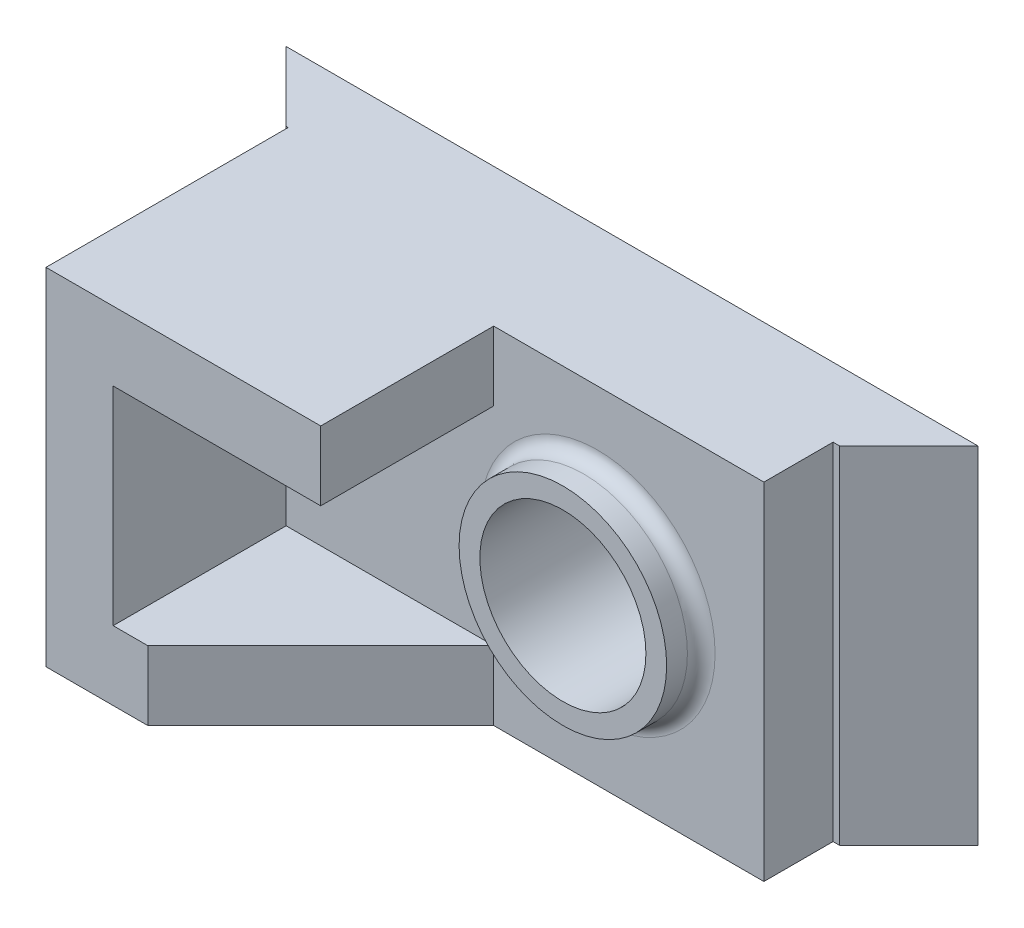
ISO-10303-21;
HEADER;
FILE_DESCRIPTION(('STEP AP214'),'2;1');
FILE_NAME('part.step','',(''),(''),'','','');
FILE_SCHEMA(('AUTOMOTIVE_DESIGN { 1 0 10303 214 1 1 1 1 }'));
ENDSEC;
DATA;
#1=APPLICATION_CONTEXT('core data for automotive mechanical design processes');
#2=APPLICATION_PROTOCOL_DEFINITION('international standard','automotive_design',2000,#1);
#3=PRODUCT_CONTEXT('',#1,'mechanical');
#4=PRODUCT('Part','Part','',(#3));
#5=PRODUCT_RELATED_PRODUCT_CATEGORY('part','',(#4));
#6=PRODUCT_DEFINITION_FORMATION('','',#4);
#7=PRODUCT_DEFINITION_CONTEXT('part definition',#1,'design');
#8=PRODUCT_DEFINITION('design','',#6,#7);
#9=PRODUCT_DEFINITION_SHAPE('','',#8);
#10=(LENGTH_UNIT() NAMED_UNIT(*) SI_UNIT(.MILLI.,.METRE.));
#11=(NAMED_UNIT(*) PLANE_ANGLE_UNIT() SI_UNIT($,.RADIAN.));
#12=(NAMED_UNIT(*) SI_UNIT($,.STERADIAN.) SOLID_ANGLE_UNIT());
#13=UNCERTAINTY_MEASURE_WITH_UNIT(LENGTH_MEASURE(1.E-05),#10,'distance_accuracy_value','');
#14=(GEOMETRIC_REPRESENTATION_CONTEXT(3) GLOBAL_UNCERTAINTY_ASSIGNED_CONTEXT((#13)) GLOBAL_UNIT_ASSIGNED_CONTEXT((#10,
#11,#12)) REPRESENTATION_CONTEXT('',''));
#15=CARTESIAN_POINT('',(0.,0.,0.));
#16=DIRECTION('',(0.,0.,1.));
#17=DIRECTION('',(1.,0.,0.));
#18=AXIS2_PLACEMENT_3D('',#15,#16,#17);
#19=CARTESIAN_POINT('',(0.,-25.,10.));
#20=DIRECTION('',(0.,1.,0.));
#21=DIRECTION('',(0.,0.,1.));
#22=AXIS2_PLACEMENT_3D('',#19,#20,#21);
#23=PLANE('',#22);
#24=DIRECTION('',(1.,0.,0.));
#25=VECTOR('',#24,1.);
#26=CARTESIAN_POINT('',(0.,-25.,10.));
#27=LINE('',#26,#25);
#28=CARTESIAN_POINT('',(-40.,-25.,10.));
#29=VERTEX_POINT('',#28);
#30=CARTESIAN_POINT('',(-39.7065882183788,-25.,10.));
#31=VERTEX_POINT('',#30);
#32=EDGE_CURVE('E239',#29,#31,#27,.T.);
#33=ORIENTED_EDGE('',*,*,#32,.F.);
#34=DIRECTION('',(-0.707106781186546,0.,-0.707106781186549));
#35=VECTOR('',#34,1.);
#36=CARTESIAN_POINT('',(-40.,-25.,10.));
#37=LINE('',#36,#35);
#38=CARTESIAN_POINT('',(-50.,-25.,0.));
#39=VERTEX_POINT('',#38);
#40=EDGE_CURVE('E58',#29,#39,#37,.T.);
#41=ORIENTED_EDGE('',*,*,#40,.T.);
#42=DIRECTION('',(1.,0.,0.));
#43=VECTOR('',#42,1.);
#44=CARTESIAN_POINT('',(0.,-25.,0.));
#45=LINE('',#44,#43);
#46=CARTESIAN_POINT('',(50.,-25.,0.));
#47=VERTEX_POINT('',#46);
#48=EDGE_CURVE('E249',#39,#47,#45,.T.);
#49=ORIENTED_EDGE('',*,*,#48,.T.);
#50=DIRECTION('',(0.707106781186549,0.,-0.707106781186547));
#51=VECTOR('',#50,1.);
#52=CARTESIAN_POINT('',(50.,-25.,0.));
#53=LINE('',#52,#51);
#54=CARTESIAN_POINT('',(40.,-25.,10.));
#55=VERTEX_POINT('',#54);
#56=EDGE_CURVE('E174',#47,#55,#53,.F.);
#57=ORIENTED_EDGE('',*,*,#56,.T.);
#58=DIRECTION('',(1.,0.,0.));
#59=VECTOR('',#58,1.);
#60=CARTESIAN_POINT('',(0.,-25.,10.));
#61=LINE('',#60,#59);
#62=CARTESIAN_POINT('',(39.0533062407241,-25.,10.));
#63=VERTEX_POINT('',#62);
#64=EDGE_CURVE('E167',#63,#55,#61,.T.);
#65=ORIENTED_EDGE('',*,*,#64,.F.);
#66=DIRECTION('',(0.,0.,-1.));
#67=VECTOR('',#66,1.);
#68=CARTESIAN_POINT('',(39.0533062407241,-25.,20.));
#69=LINE('',#68,#67);
#70=CARTESIAN_POINT('',(39.0533062407241,-25.,20.));
#71=VERTEX_POINT('',#70);
#72=EDGE_CURVE('E150',#71,#63,#69,.T.);
#73=ORIENTED_EDGE('',*,*,#72,.F.);
#74=DIRECTION('',(1.,0.,0.));
#75=VECTOR('',#74,1.);
#76=CARTESIAN_POINT('',(0.,-25.,20.));
#77=LINE('',#76,#75);
#78=CARTESIAN_POINT('',(0.,-25.,20.));
#79=VERTEX_POINT('',#78);
#80=EDGE_CURVE('E161',#79,#71,#77,.T.);
#81=ORIENTED_EDGE('',*,*,#80,.F.);
#82=DIRECTION('',(0.707106781186549,0.,-0.707106781186546));
#83=VECTOR('',#82,1.);
#84=CARTESIAN_POINT('',(0.,-25.,20.));
#85=LINE('',#84,#83);
#86=CARTESIAN_POINT('',(-25.0000000000001,-25.,45.));
#87=VERTEX_POINT('',#86);
#88=EDGE_CURVE('E258',#79,#87,#85,.F.);
#89=ORIENTED_EDGE('',*,*,#88,.T.);
#90=DIRECTION('',(1.,0.,0.));
#91=VECTOR('',#90,1.);
#92=CARTESIAN_POINT('',(0.,-25.,45.));
#93=LINE('',#92,#91);
#94=CARTESIAN_POINT('',(-39.7065882183788,-25.,45.));
#95=VERTEX_POINT('',#94);
#96=EDGE_CURVE('E214',#95,#87,#93,.T.);
#97=ORIENTED_EDGE('',*,*,#96,.F.);
#98=DIRECTION('',(0.,0.,-1.));
#99=VECTOR('',#98,1.);
#100=CARTESIAN_POINT('',(-39.7065882183788,-25.,45.));
#101=LINE('',#100,#99);
#102=EDGE_CURVE('E223',#95,#31,#101,.T.);
#103=ORIENTED_EDGE('',*,*,#102,.T.);
#104=EDGE_LOOP('',(#33,#41,#49,#57,#65,#73,#81,#89,#97,#103));
#105=FACE_BOUND('',#104,.T.);
#106=ADVANCED_FACE('F49',(#105),#23,.F.);
#107=CARTESIAN_POINT('',(0.,25.,10.));
#108=DIRECTION('',(0.,1.,0.));
#109=DIRECTION('',(0.,0.,1.));
#110=AXIS2_PLACEMENT_3D('',#107,#108,#109);
#111=PLANE('',#110);
#112=DIRECTION('',(1.,0.,0.));
#113=VECTOR('',#112,1.);
#114=CARTESIAN_POINT('',(0.,25.,0.));
#115=LINE('',#114,#113);
#116=CARTESIAN_POINT('',(-50.,25.,0.));
#117=VERTEX_POINT('',#116);
#118=CARTESIAN_POINT('',(50.,25.,0.));
#119=VERTEX_POINT('',#118);
#120=EDGE_CURVE('E242',#117,#119,#115,.T.);
#121=ORIENTED_EDGE('',*,*,#120,.F.);
#122=DIRECTION('',(0.707106781186546,0.,0.707106781186549));
#123=VECTOR('',#122,1.);
#124=CARTESIAN_POINT('',(-20.0000000000001,25.,30.));
#125=LINE('',#124,#123);
#126=CARTESIAN_POINT('',(-40.,25.,10.));
#127=VERTEX_POINT('',#126);
#128=EDGE_CURVE('E12',#117,#127,#125,.T.);
#129=ORIENTED_EDGE('',*,*,#128,.T.);
#130=DIRECTION('',(1.,0.,0.));
#131=VECTOR('',#130,1.);
#132=CARTESIAN_POINT('',(0.,25.,10.));
#133=LINE('',#132,#131);
#134=CARTESIAN_POINT('',(-39.7065882183788,25.,10.));
#135=VERTEX_POINT('',#134);
#136=EDGE_CURVE('E245',#127,#135,#133,.T.);
#137=ORIENTED_EDGE('',*,*,#136,.T.);
#138=DIRECTION('',(0.,0.,-1.));
#139=VECTOR('',#138,1.);
#140=CARTESIAN_POINT('',(-39.7065882183788,25.,45.));
#141=LINE('',#140,#139);
#142=CARTESIAN_POINT('',(-39.7065882183788,25.,45.));
#143=VERTEX_POINT('',#142);
#144=EDGE_CURVE('E226',#143,#135,#141,.T.);
#145=ORIENTED_EDGE('',*,*,#144,.F.);
#146=DIRECTION('',(1.,0.,0.));
#147=VECTOR('',#146,1.);
#148=CARTESIAN_POINT('',(0.,25.,45.));
#149=LINE('',#148,#147);
#150=CARTESIAN_POINT('',(0.,25.,45.));
#151=VERTEX_POINT('',#150);
#152=EDGE_CURVE('E209',#143,#151,#149,.T.);
#153=ORIENTED_EDGE('',*,*,#152,.T.);
#154=DIRECTION('',(0.,0.,-1.));
#155=VECTOR('',#154,1.);
#156=CARTESIAN_POINT('',(0.,25.,45.));
#157=LINE('',#156,#155);
#158=CARTESIAN_POINT('',(0.,25.,20.));
#159=VERTEX_POINT('',#158);
#160=EDGE_CURVE('E229',#151,#159,#157,.T.);
#161=ORIENTED_EDGE('',*,*,#160,.T.);
#162=DIRECTION('',(1.,0.,0.));
#163=VECTOR('',#162,1.);
#164=CARTESIAN_POINT('',(0.,25.,20.));
#165=LINE('',#164,#163);
#166=CARTESIAN_POINT('',(39.0533062407241,25.,20.));
#167=VERTEX_POINT('',#166);
#168=EDGE_CURVE('E176',#159,#167,#165,.T.);
#169=ORIENTED_EDGE('',*,*,#168,.T.);
#170=DIRECTION('',(0.,0.,-1.));
#171=VECTOR('',#170,1.);
#172=CARTESIAN_POINT('',(39.0533062407241,25.,20.));
#173=LINE('',#172,#171);
#174=CARTESIAN_POINT('',(39.0533062407241,25.,10.));
#175=VERTEX_POINT('',#174);
#176=EDGE_CURVE('E160',#167,#175,#173,.T.);
#177=ORIENTED_EDGE('',*,*,#176,.T.);
#178=DIRECTION('',(1.,0.,0.));
#179=VECTOR('',#178,1.);
#180=CARTESIAN_POINT('',(0.,25.,10.));
#181=LINE('',#180,#179);
#182=CARTESIAN_POINT('',(40.,25.,10.));
#183=VERTEX_POINT('',#182);
#184=EDGE_CURVE('E170',#175,#183,#181,.T.);
#185=ORIENTED_EDGE('',*,*,#184,.T.);
#186=DIRECTION('',(-0.707106781186549,0.,0.707106781186547));
#187=VECTOR('',#186,1.);
#188=CARTESIAN_POINT('',(19.9999999999999,25.,30.));
#189=LINE('',#188,#187);
#190=EDGE_CURVE('E267',#183,#119,#189,.F.);
#191=ORIENTED_EDGE('',*,*,#190,.T.);
#192=EDGE_LOOP('',(#121,#129,#137,#145,#153,#161,#169,#177,#185,#191));
#193=FACE_BOUND('',#192,.T.);
#194=ADVANCED_FACE('F278',(#193),#111,.T.);
#195=CARTESIAN_POINT('',(0.,0.,10.));
#196=DIRECTION('',(0.,0.,1.));
#197=DIRECTION('',(1.,0.,0.));
#198=AXIS2_PLACEMENT_3D('',#195,#196,#197);
#199=PLANE('',#198);
#200=ORIENTED_EDGE('',*,*,#136,.F.);
#201=DIRECTION('',(0.,-1.,0.));
#202=VECTOR('',#201,1.);
#203=CARTESIAN_POINT('',(-40.,-25.,10.));
#204=LINE('',#203,#202);
#205=EDGE_CURVE('E269',#127,#29,#204,.T.);
#206=ORIENTED_EDGE('',*,*,#205,.T.);
#207=ORIENTED_EDGE('',*,*,#32,.T.);
#208=DIRECTION('',(0.,-1.,0.));
#209=VECTOR('',#208,1.);
#210=CARTESIAN_POINT('',(-39.7065882183788,0.,10.));
#211=LINE('',#210,#209);
#212=EDGE_CURVE('E241',#135,#31,#211,.T.);
#213=ORIENTED_EDGE('',*,*,#212,.F.);
#214=EDGE_LOOP('',(#200,#206,#207,#213));
#215=FACE_BOUND('',#214,.T.);
#216=ADVANCED_FACE('F276',(#215),#199,.T.);
#217=CARTESIAN_POINT('',(0.,0.,0.));
#218=DIRECTION('',(0.,0.,1.));
#219=DIRECTION('',(1.,0.,0.));
#220=AXIS2_PLACEMENT_3D('',#217,#218,#219);
#221=PLANE('',#220);
#222=ORIENTED_EDGE('',*,*,#120,.T.);
#223=DIRECTION('',(0.,-1.,0.));
#224=VECTOR('',#223,1.);
#225=CARTESIAN_POINT('',(50.,0.,0.));
#226=LINE('',#225,#224);
#227=EDGE_CURVE('E180',#119,#47,#226,.T.);
#228=ORIENTED_EDGE('',*,*,#227,.T.);
#229=ORIENTED_EDGE('',*,*,#48,.F.);
#230=DIRECTION('',(0.,-1.,0.));
#231=VECTOR('',#230,1.);
#232=CARTESIAN_POINT('',(-50.,0.,0.));
#233=LINE('',#232,#231);
#234=EDGE_CURVE('E238',#117,#39,#233,.T.);
#235=ORIENTED_EDGE('',*,*,#234,.F.);
#236=EDGE_LOOP('',(#222,#228,#229,#235));
#237=FACE_BOUND('',#236,.T.);
#238=CARTESIAN_POINT('',(15.,0.,0.));
#239=DIRECTION('',(0.,0.,1.));
#240=DIRECTION('',(1.,0.,0.));
#241=AXIS2_PLACEMENT_3D('',#238,#239,#240);
#242=CIRCLE('',#241,12.);
#243=CARTESIAN_POINT('',(27.,0.,0.));
#244=VERTEX_POINT('',#243);
#245=EDGE_CURVE('E350',#244,#244,#242,.T.);
#246=ORIENTED_EDGE('',*,*,#245,.T.);
#247=EDGE_LOOP('',(#246));
#248=FACE_BOUND('',#247,.T.);
#249=ADVANCED_FACE('F272',(#237,#248),#221,.F.);
#250=CARTESIAN_POINT('',(-39.7065882183788,0.,45.));
#251=DIRECTION('',(1.,0.,0.));
#252=DIRECTION('',(0.,0.,-1.));
#253=AXIS2_PLACEMENT_3D('',#250,#251,#252);
#254=PLANE('',#253);
#255=ORIENTED_EDGE('',*,*,#144,.T.);
#256=ORIENTED_EDGE('',*,*,#212,.T.);
#257=ORIENTED_EDGE('',*,*,#102,.F.);
#258=DIRECTION('',(0.,-1.,0.));
#259=VECTOR('',#258,1.);
#260=CARTESIAN_POINT('',(-39.7065882183788,0.,45.));
#261=LINE('',#260,#259);
#262=EDGE_CURVE('E212',#143,#95,#261,.T.);
#263=ORIENTED_EDGE('',*,*,#262,.F.);
#264=EDGE_LOOP('',(#255,#256,#257,#263));
#265=FACE_BOUND('',#264,.T.);
#266=ADVANCED_FACE('F283',(#265),#254,.F.);
#267=CARTESIAN_POINT('',(-30.,0.,45.));
#268=DIRECTION('',(1.,0.,0.));
#269=DIRECTION('',(0.,1.,0.));
#270=AXIS2_PLACEMENT_3D('',#267,#268,#269);
#271=PLANE('',#270);
#272=DIRECTION('',(0.,-1.,0.));
#273=VECTOR('',#272,1.);
#274=CARTESIAN_POINT('',(-30.,0.,20.));
#275=LINE('',#274,#273);
#276=CARTESIAN_POINT('',(-30.,15.,20.));
#277=VERTEX_POINT('',#276);
#278=CARTESIAN_POINT('',(-30.,-15.,20.));
#279=VERTEX_POINT('',#278);
#280=EDGE_CURVE('E191',#277,#279,#275,.T.);
#281=ORIENTED_EDGE('',*,*,#280,.F.);
#282=DIRECTION('',(0.,0.,-1.));
#283=VECTOR('',#282,1.);
#284=CARTESIAN_POINT('',(-30.,15.,45.));
#285=LINE('',#284,#283);
#286=CARTESIAN_POINT('',(-30.,15.,45.));
#287=VERTEX_POINT('',#286);
#288=EDGE_CURVE('E235',#287,#277,#285,.T.);
#289=ORIENTED_EDGE('',*,*,#288,.F.);
#290=DIRECTION('',(0.,-1.,0.));
#291=VECTOR('',#290,1.);
#292=CARTESIAN_POINT('',(-30.,0.,45.));
#293=LINE('',#292,#291);
#294=CARTESIAN_POINT('',(-30.,-15.,45.));
#295=VERTEX_POINT('',#294);
#296=EDGE_CURVE('E201',#287,#295,#293,.T.);
#297=ORIENTED_EDGE('',*,*,#296,.T.);
#298=DIRECTION('',(0.,0.,-1.));
#299=VECTOR('',#298,1.);
#300=CARTESIAN_POINT('',(-30.,-15.,45.));
#301=LINE('',#300,#299);
#302=EDGE_CURVE('E220',#295,#279,#301,.T.);
#303=ORIENTED_EDGE('',*,*,#302,.T.);
#304=EDGE_LOOP('',(#281,#289,#297,#303));
#305=FACE_BOUND('',#304,.T.);
#306=ADVANCED_FACE('F307',(#305),#271,.T.);
#307=CARTESIAN_POINT('',(0.,15.,45.));
#308=DIRECTION('',(0.,1.,0.));
#309=DIRECTION('',(0.,0.,1.));
#310=AXIS2_PLACEMENT_3D('',#307,#308,#309);
#311=PLANE('',#310);
#312=ORIENTED_EDGE('',*,*,#288,.T.);
#313=DIRECTION('',(1.,0.,0.));
#314=VECTOR('',#313,1.);
#315=CARTESIAN_POINT('',(0.,15.,20.));
#316=LINE('',#315,#314);
#317=CARTESIAN_POINT('',(0.,15.,20.));
#318=VERTEX_POINT('',#317);
#319=EDGE_CURVE('E188',#277,#318,#316,.T.);
#320=ORIENTED_EDGE('',*,*,#319,.T.);
#321=DIRECTION('',(0.,0.,-1.));
#322=VECTOR('',#321,1.);
#323=CARTESIAN_POINT('',(0.,15.,45.));
#324=LINE('',#323,#322);
#325=CARTESIAN_POINT('',(0.,15.,45.));
#326=VERTEX_POINT('',#325);
#327=EDGE_CURVE('E232',#326,#318,#324,.T.);
#328=ORIENTED_EDGE('',*,*,#327,.F.);
#329=DIRECTION('',(1.,0.,0.));
#330=VECTOR('',#329,1.);
#331=CARTESIAN_POINT('',(0.,15.,45.));
#332=LINE('',#331,#330);
#333=EDGE_CURVE('E204',#287,#326,#332,.T.);
#334=ORIENTED_EDGE('',*,*,#333,.F.);
#335=EDGE_LOOP('',(#312,#320,#328,#334));
#336=FACE_BOUND('',#335,.T.);
#337=ADVANCED_FACE('F309',(#336),#311,.F.);
#338=CARTESIAN_POINT('',(0.,0.,45.));
#339=DIRECTION('',(1.,0.,0.));
#340=DIRECTION('',(0.,1.,0.));
#341=AXIS2_PLACEMENT_3D('',#338,#339,#340);
#342=PLANE('',#341);
#343=DIRECTION('',(0.,-1.,0.));
#344=VECTOR('',#343,1.);
#345=CARTESIAN_POINT('',(0.,0.,20.));
#346=LINE('',#345,#344);
#347=EDGE_CURVE('E186',#159,#318,#346,.T.);
#348=ORIENTED_EDGE('',*,*,#347,.F.);
#349=ORIENTED_EDGE('',*,*,#160,.F.);
#350=DIRECTION('',(0.,-1.,0.));
#351=VECTOR('',#350,1.);
#352=CARTESIAN_POINT('',(0.,0.,45.));
#353=LINE('',#352,#351);
#354=EDGE_CURVE('E206',#151,#326,#353,.T.);
#355=ORIENTED_EDGE('',*,*,#354,.T.);
#356=ORIENTED_EDGE('',*,*,#327,.T.);
#357=EDGE_LOOP('',(#348,#349,#355,#356));
#358=FACE_BOUND('',#357,.T.);
#359=ADVANCED_FACE('F293',(#358),#342,.T.);
#360=CARTESIAN_POINT('',(0.,-15.,45.));
#361=DIRECTION('',(0.,1.,0.));
#362=DIRECTION('',(-1.,0.,0.));
#363=AXIS2_PLACEMENT_3D('',#360,#361,#362);
#364=PLANE('',#363);
#365=DIRECTION('',(1.,0.,0.));
#366=VECTOR('',#365,1.);
#367=CARTESIAN_POINT('',(0.,-15.,45.));
#368=LINE('',#367,#366);
#369=CARTESIAN_POINT('',(-25.0000000000001,-15.,45.));
#370=VERTEX_POINT('',#369);
#371=EDGE_CURVE('E217',#295,#370,#368,.T.);
#372=ORIENTED_EDGE('',*,*,#371,.T.);
#373=DIRECTION('',(-0.707106781186549,0.,0.707106781186546));
#374=VECTOR('',#373,1.);
#375=CARTESIAN_POINT('',(-12.5,-15.,32.5));
#376=LINE('',#375,#374);
#377=CARTESIAN_POINT('',(0.,-15.,20.));
#378=VERTEX_POINT('',#377);
#379=EDGE_CURVE('E262',#370,#378,#376,.F.);
#380=ORIENTED_EDGE('',*,*,#379,.T.);
#381=DIRECTION('',(1.,0.,0.));
#382=VECTOR('',#381,1.);
#383=CARTESIAN_POINT('',(0.,-15.,20.));
#384=LINE('',#383,#382);
#385=EDGE_CURVE('E193',#279,#378,#384,.T.);
#386=ORIENTED_EDGE('',*,*,#385,.F.);
#387=ORIENTED_EDGE('',*,*,#302,.F.);
#388=EDGE_LOOP('',(#372,#380,#386,#387));
#389=FACE_BOUND('',#388,.T.);
#390=ADVANCED_FACE('F304',(#389),#364,.T.);
#391=CARTESIAN_POINT('',(0.,0.,45.));
#392=DIRECTION('',(0.,0.,1.));
#393=DIRECTION('',(1.,0.,0.));
#394=AXIS2_PLACEMENT_3D('',#391,#392,#393);
#395=PLANE('',#394);
#396=ORIENTED_EDGE('',*,*,#96,.T.);
#397=DIRECTION('',(0.,1.,0.));
#398=VECTOR('',#397,1.);
#399=CARTESIAN_POINT('',(-25.0000000000001,0.,45.));
#400=LINE('',#399,#398);
#401=EDGE_CURVE('E260',#87,#370,#400,.T.);
#402=ORIENTED_EDGE('',*,*,#401,.T.);
#403=ORIENTED_EDGE('',*,*,#371,.F.);
#404=ORIENTED_EDGE('',*,*,#296,.F.);
#405=ORIENTED_EDGE('',*,*,#333,.T.);
#406=ORIENTED_EDGE('',*,*,#354,.F.);
#407=ORIENTED_EDGE('',*,*,#152,.F.);
#408=ORIENTED_EDGE('',*,*,#262,.T.);
#409=EDGE_LOOP('',(#396,#402,#403,#404,#405,#406,#407,#408));
#410=FACE_BOUND('',#409,.T.);
#411=ADVANCED_FACE('F287',(#410),#395,.T.);
#412=CARTESIAN_POINT('',(39.0533062407241,0.,20.));
#413=DIRECTION('',(1.,0.,0.));
#414=DIRECTION('',(0.,0.,-1.));
#415=AXIS2_PLACEMENT_3D('',#412,#413,#414);
#416=PLANE('',#415);
#417=DIRECTION('',(0.,-1.,0.));
#418=VECTOR('',#417,1.);
#419=CARTESIAN_POINT('',(39.0533062407241,0.,10.));
#420=LINE('',#419,#418);
#421=EDGE_CURVE('E153',#175,#63,#420,.T.);
#422=ORIENTED_EDGE('',*,*,#421,.F.);
#423=ORIENTED_EDGE('',*,*,#176,.F.);
#424=DIRECTION('',(0.,-1.,0.));
#425=VECTOR('',#424,1.);
#426=CARTESIAN_POINT('',(39.0533062407241,0.,20.));
#427=LINE('',#426,#425);
#428=EDGE_CURVE('E156',#167,#71,#427,.T.);
#429=ORIENTED_EDGE('',*,*,#428,.T.);
#430=ORIENTED_EDGE('',*,*,#72,.T.);
#431=EDGE_LOOP('',(#422,#423,#429,#430));
#432=FACE_BOUND('',#431,.T.);
#433=ADVANCED_FACE('F152',(#432),#416,.T.);
#434=CARTESIAN_POINT('',(0.,0.,20.));
#435=DIRECTION('',(0.,0.,1.));
#436=DIRECTION('',(1.,0.,0.));
#437=AXIS2_PLACEMENT_3D('',#434,#435,#436);
#438=PLANE('',#437);
#439=CARTESIAN_POINT('',(15.,0.,20.));
#440=DIRECTION('',(0.,0.,1.));
#441=DIRECTION('',(1.,0.,0.));
#442=AXIS2_PLACEMENT_3D('',#439,#440,#441);
#443=CIRCLE('',#442,17.);
#444=CARTESIAN_POINT('',(32.,0.,20.));
#445=VERTEX_POINT('',#444);
#446=EDGE_CURVE('E255',#445,#445,#443,.F.);
#447=ORIENTED_EDGE('',*,*,#446,.T.);
#448=EDGE_LOOP('',(#447));
#449=FACE_BOUND('',#448,.T.);
#450=ORIENTED_EDGE('',*,*,#428,.F.);
#451=ORIENTED_EDGE('',*,*,#168,.F.);
#452=ORIENTED_EDGE('',*,*,#347,.T.);
#453=ORIENTED_EDGE('',*,*,#319,.F.);
#454=ORIENTED_EDGE('',*,*,#280,.T.);
#455=ORIENTED_EDGE('',*,*,#385,.T.);
#456=DIRECTION('',(0.,-1.,0.));
#457=VECTOR('',#456,1.);
#458=CARTESIAN_POINT('',(0.,0.,20.));
#459=LINE('',#458,#457);
#460=EDGE_CURVE('E196',#378,#79,#459,.T.);
#461=ORIENTED_EDGE('',*,*,#460,.T.);
#462=ORIENTED_EDGE('',*,*,#80,.T.);
#463=EDGE_LOOP('',(#450,#451,#452,#453,#454,#455,#461,#462));
#464=FACE_BOUND('',#463,.T.);
#465=ADVANCED_FACE('F295',(#449,#464),#438,.T.);
#466=CARTESIAN_POINT('',(0.,0.,10.));
#467=DIRECTION('',(0.,0.,1.));
#468=DIRECTION('',(1.,0.,0.));
#469=AXIS2_PLACEMENT_3D('',#466,#467,#468);
#470=PLANE('',#469);
#471=ORIENTED_EDGE('',*,*,#64,.T.);
#472=DIRECTION('',(0.,1.,0.));
#473=VECTOR('',#472,1.);
#474=CARTESIAN_POINT('',(40.,0.,10.));
#475=LINE('',#474,#473);
#476=EDGE_CURVE('E265',#55,#183,#475,.T.);
#477=ORIENTED_EDGE('',*,*,#476,.T.);
#478=ORIENTED_EDGE('',*,*,#184,.F.);
#479=ORIENTED_EDGE('',*,*,#421,.T.);
#480=EDGE_LOOP('',(#471,#477,#478,#479));
#481=FACE_BOUND('',#480,.T.);
#482=ADVANCED_FACE('F166',(#481),#470,.T.);
#483=CARTESIAN_POINT('',(0.,0.,25.));
#484=DIRECTION('',(0.,0.,1.));
#485=DIRECTION('',(1.,0.,0.));
#486=AXIS2_PLACEMENT_3D('',#483,#484,#485);
#487=PLANE('',#486);
#488=CARTESIAN_POINT('',(15.,0.,25.));
#489=DIRECTION('',(0.,0.,1.));
#490=DIRECTION('',(1.,0.,0.));
#491=AXIS2_PLACEMENT_3D('',#488,#489,#490);
#492=CIRCLE('',#491,15.);
#493=CARTESIAN_POINT('',(30.,0.,25.));
#494=VERTEX_POINT('',#493);
#495=EDGE_CURVE('E182',#494,#494,#492,.T.);
#496=ORIENTED_EDGE('',*,*,#495,.T.);
#497=EDGE_LOOP('',(#496));
#498=FACE_BOUND('',#497,.T.);
#499=CARTESIAN_POINT('',(15.,0.,25.));
#500=DIRECTION('',(0.,0.,1.));
#501=DIRECTION('',(1.,0.,0.));
#502=AXIS2_PLACEMENT_3D('',#499,#500,#501);
#503=CIRCLE('',#502,12.);
#504=CARTESIAN_POINT('',(27.,0.,25.));
#505=VERTEX_POINT('',#504);
#506=EDGE_CURVE('E349',#505,#505,#503,.T.);
#507=ORIENTED_EDGE('',*,*,#506,.F.);
#508=EDGE_LOOP('',(#507));
#509=FACE_BOUND('',#508,.T.);
#510=ADVANCED_FACE('F358',(#498,#509),#487,.T.);
#511=CARTESIAN_POINT('',(15.,0.,25.));
#512=DIRECTION('',(0.,0.,-1.));
#513=DIRECTION('',(-1.,0.,0.));
#514=AXIS2_PLACEMENT_3D('',#511,#512,#513);
#515=CYLINDRICAL_SURFACE('',#514,15.);
#516=CARTESIAN_POINT('',(15.,0.,22.));
#517=DIRECTION('',(0.,0.,1.));
#518=DIRECTION('',(1.,0.,0.));
#519=AXIS2_PLACEMENT_3D('',#516,#517,#518);
#520=CIRCLE('',#519,15.);
#521=CARTESIAN_POINT('',(30.,0.,22.));
#522=VERTEX_POINT('',#521);
#523=EDGE_CURVE('E247',#522,#522,#520,.T.);
#524=ORIENTED_EDGE('',*,*,#523,.T.);
#525=EDGE_LOOP('',(#524));
#526=FACE_BOUND('',#525,.T.);
#527=ORIENTED_EDGE('',*,*,#495,.F.);
#528=EDGE_LOOP('',(#527));
#529=FACE_BOUND('',#528,.T.);
#530=ADVANCED_FACE('F360',(#526,#529),#515,.T.);
#531=CARTESIAN_POINT('',(15.,0.,25.));
#532=DIRECTION('',(0.,0.,-1.));
#533=DIRECTION('',(-1.,0.,0.));
#534=AXIS2_PLACEMENT_3D('',#531,#532,#533);
#535=CYLINDRICAL_SURFACE('',#534,12.);
#536=ORIENTED_EDGE('',*,*,#506,.T.);
#537=EDGE_LOOP('',(#536));
#538=FACE_BOUND('',#537,.T.);
#539=ORIENTED_EDGE('',*,*,#245,.F.);
#540=EDGE_LOOP('',(#539));
#541=FACE_BOUND('',#540,.T.);
#542=ADVANCED_FACE('F330',(#538,#541),#535,.F.);
#543=CARTESIAN_POINT('',(15.,0.,22.));
#544=DIRECTION('',(0.,0.,1.));
#545=DIRECTION('',(1.,0.,0.));
#546=AXIS2_PLACEMENT_3D('',#543,#544,#545);
#547=TOROIDAL_SURFACE('',#546,17.,2.);
#548=ORIENTED_EDGE('',*,*,#446,.F.);
#549=EDGE_LOOP('',(#548));
#550=FACE_BOUND('',#549,.T.);
#551=ORIENTED_EDGE('',*,*,#523,.F.);
#552=EDGE_LOOP('',(#551));
#553=FACE_BOUND('',#552,.T.);
#554=ADVANCED_FACE('F327',(#550,#553),#547,.F.);
#555=CARTESIAN_POINT('',(0.,0.,20.));
#556=DIRECTION('',(-0.707106781186546,0.,-0.707106781186549));
#557=DIRECTION('',(0.,-1.,0.));
#558=AXIS2_PLACEMENT_3D('',#555,#556,#557);
#559=PLANE('',#558);
#560=ORIENTED_EDGE('',*,*,#379,.F.);
#561=ORIENTED_EDGE('',*,*,#401,.F.);
#562=ORIENTED_EDGE('',*,*,#88,.F.);
#563=ORIENTED_EDGE('',*,*,#460,.F.);
#564=EDGE_LOOP('',(#560,#561,#562,#563));
#565=FACE_BOUND('',#564,.T.);
#566=ADVANCED_FACE('F301',(#565),#559,.F.);
#567=CARTESIAN_POINT('',(50.,0.,0.));
#568=DIRECTION('',(-0.707106781186546,0.,-0.707106781186548));
#569=DIRECTION('',(0.,-1.,0.));
#570=AXIS2_PLACEMENT_3D('',#567,#568,#569);
#571=PLANE('',#570);
#572=ORIENTED_EDGE('',*,*,#190,.F.);
#573=ORIENTED_EDGE('',*,*,#476,.F.);
#574=ORIENTED_EDGE('',*,*,#56,.F.);
#575=ORIENTED_EDGE('',*,*,#227,.F.);
#576=EDGE_LOOP('',(#572,#573,#574,#575));
#577=FACE_BOUND('',#576,.T.);
#578=ADVANCED_FACE('F337',(#577),#571,.F.);
#579=CARTESIAN_POINT('',(-40.,0.,10.));
#580=DIRECTION('',(-0.707106781186549,0.,0.707106781186546));
#581=DIRECTION('',(0.,1.,0.));
#582=AXIS2_PLACEMENT_3D('',#579,#580,#581);
#583=PLANE('',#582);
#584=ORIENTED_EDGE('',*,*,#128,.F.);
#585=ORIENTED_EDGE('',*,*,#234,.T.);
#586=ORIENTED_EDGE('',*,*,#40,.F.);
#587=ORIENTED_EDGE('',*,*,#205,.F.);
#588=EDGE_LOOP('',(#584,#585,#586,#587));
#589=FACE_BOUND('',#588,.T.);
#590=ADVANCED_FACE('F52',(#589),#583,.T.);
#591=CLOSED_SHELL('',(#106,#194,#216,#249,#266,#306,#337,#359,#390,#411,#433,#465,#482,#510,
#530,#542,#554,#566,#578,#590));
#592=MANIFOLD_SOLID_BREP('B2',#591);
#593=ADVANCED_BREP_SHAPE_REPRESENTATION('',(#18,#592),#14);
#594=SHAPE_DEFINITION_REPRESENTATION(#9,#593);
ENDSEC;
END-ISO-10303-21;
